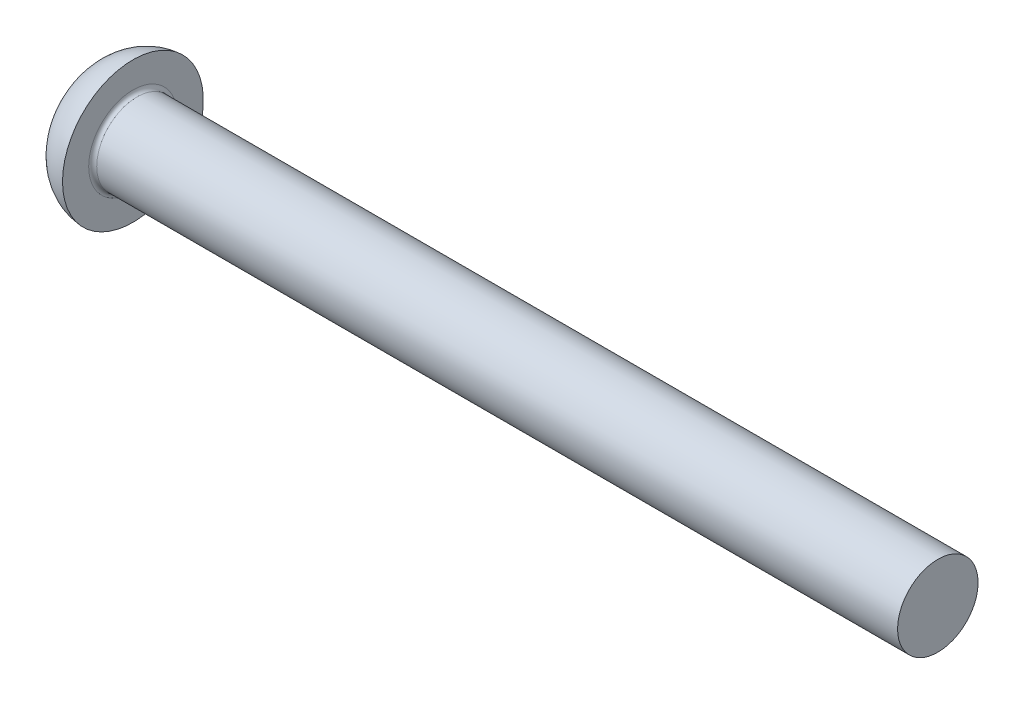
ISO-10303-21;
HEADER;
FILE_DESCRIPTION(('STEP AP214'),'2;1');
FILE_NAME('part.step','',(''),(''),'','','');
FILE_SCHEMA(('AUTOMOTIVE_DESIGN { 1 0 10303 214 1 1 1 1 }'));
ENDSEC;
DATA;
#1=APPLICATION_CONTEXT('core data for automotive mechanical design processes');
#2=APPLICATION_PROTOCOL_DEFINITION('international standard','automotive_design',2000,#1);
#3=PRODUCT_CONTEXT('',#1,'mechanical');
#4=PRODUCT('Part','Part','',(#3));
#5=PRODUCT_RELATED_PRODUCT_CATEGORY('part','',(#4));
#6=PRODUCT_DEFINITION_FORMATION('','',#4);
#7=PRODUCT_DEFINITION_CONTEXT('part definition',#1,'design');
#8=PRODUCT_DEFINITION('design','',#6,#7);
#9=PRODUCT_DEFINITION_SHAPE('','',#8);
#10=(LENGTH_UNIT() NAMED_UNIT(*) SI_UNIT(.MILLI.,.METRE.));
#11=(NAMED_UNIT(*) PLANE_ANGLE_UNIT() SI_UNIT($,.RADIAN.));
#12=(NAMED_UNIT(*) SI_UNIT($,.STERADIAN.) SOLID_ANGLE_UNIT());
#13=UNCERTAINTY_MEASURE_WITH_UNIT(LENGTH_MEASURE(1.E-05),#10,'distance_accuracy_value','');
#14=(GEOMETRIC_REPRESENTATION_CONTEXT(3) GLOBAL_UNCERTAINTY_ASSIGNED_CONTEXT((#13)) GLOBAL_UNIT_ASSIGNED_CONTEXT((#10,
#11,#12)) REPRESENTATION_CONTEXT('',''));
#15=CARTESIAN_POINT('',(0.,0.,0.));
#16=DIRECTION('',(0.,0.,1.));
#17=DIRECTION('',(1.,0.,0.));
#18=AXIS2_PLACEMENT_3D('',#15,#16,#17);
#19=CARTESIAN_POINT('',(0.91,0.596290812545845,0.231));
#20=DIRECTION('',(1.,0.,0.));
#21=DIRECTION('',(0.,0.,-1.));
#22=AXIS2_PLACEMENT_3D('',#19,#20,#21);
#23=PLANE('',#22);
#24=DIRECTION('',(0.,0.,-1.));
#25=VECTOR('',#24,1.);
#26=CARTESIAN_POINT('',(0.91,0.230999999999997,0.596290812545845));
#27=LINE('',#26,#25);
#28=CARTESIAN_POINT('',(0.91,0.231000000000002,-0.596290812545844));
#29=VERTEX_POINT('',#28);
#30=CARTESIAN_POINT('',(0.909999999988159,0.231000000000001,-0.379840049022971));
#31=VERTEX_POINT('',#30);
#32=EDGE_CURVE('E278',#29,#31,#27,.F.);
#33=ORIENTED_EDGE('',*,*,#32,.F.);
#34=DIRECTION('',(0.,1.,0.));
#35=VECTOR('',#34,1.);
#36=CARTESIAN_POINT('',(0.91,0.231000000000004,-0.596290812545844));
#37=LINE('',#36,#35);
#38=CARTESIAN_POINT('',(0.91,-0.230999999999997,-0.596290812545845));
#39=VERTEX_POINT('',#38);
#40=EDGE_CURVE('E284',#39,#29,#37,.T.);
#41=ORIENTED_EDGE('',*,*,#40,.F.);
#42=DIRECTION('',(0.,0.,1.));
#43=VECTOR('',#42,1.);
#44=CARTESIAN_POINT('',(0.91,-0.230999999999998,-0.596290812545845));
#45=LINE('',#44,#43);
#46=CARTESIAN_POINT('',(0.909999999988159,-0.230999999999999,-0.379840049022973));
#47=VERTEX_POINT('',#46);
#48=EDGE_CURVE('E285',#47,#39,#45,.F.);
#49=ORIENTED_EDGE('',*,*,#48,.F.);
#50=CARTESIAN_POINT('',(0.910000000000111,0.,0.));
#51=DIRECTION('',(-1.,0.,0.));
#52=DIRECTION('',(0.,0.,1.));
#53=AXIS2_PLACEMENT_3D('',#50,#51,#52);
#54=CIRCLE('',#53,0.444566601131235);
#55=EDGE_CURVE('E556',#47,#31,#54,.F.);
#56=ORIENTED_EDGE('',*,*,#55,.T.);
#57=EDGE_LOOP('',(#33,#41,#49,#56));
#58=FACE_BOUND('',#57,.T.);
#59=ADVANCED_FACE('F17',(#58),#23,.F.);
#60=CARTESIAN_POINT('',(0.91,0.596290812545845,0.231));
#61=DIRECTION('',(1.,0.,0.));
#62=DIRECTION('',(0.,0.,-1.));
#63=AXIS2_PLACEMENT_3D('',#60,#61,#62);
#64=PLANE('',#63);
#65=DIRECTION('',(0.,1.,0.));
#66=VECTOR('',#65,1.);
#67=CARTESIAN_POINT('',(0.91,-0.596290812545844,0.231));
#68=LINE('',#67,#66);
#69=CARTESIAN_POINT('',(0.91,0.596290812545844,0.231));
#70=VERTEX_POINT('',#69);
#71=CARTESIAN_POINT('',(0.909999999988159,0.379840049022972,0.231));
#72=VERTEX_POINT('',#71);
#73=EDGE_CURVE('E141',#70,#72,#68,.F.);
#74=ORIENTED_EDGE('',*,*,#73,.F.);
#75=DIRECTION('',(0.,0.,1.));
#76=VECTOR('',#75,1.);
#77=CARTESIAN_POINT('',(0.91,0.596290812545845,0.231));
#78=LINE('',#77,#76);
#79=CARTESIAN_POINT('',(0.91,0.596290812545845,-0.231));
#80=VERTEX_POINT('',#79);
#81=EDGE_CURVE('E159',#80,#70,#78,.T.);
#82=ORIENTED_EDGE('',*,*,#81,.F.);
#83=DIRECTION('',(0.,1.,0.));
#84=VECTOR('',#83,1.);
#85=CARTESIAN_POINT('',(0.91,0.596290812545845,-0.231));
#86=LINE('',#85,#84);
#87=CARTESIAN_POINT('',(0.909999999988159,0.379840049022972,-0.231));
#88=VERTEX_POINT('',#87);
#89=EDGE_CURVE('E143',#88,#80,#86,.T.);
#90=ORIENTED_EDGE('',*,*,#89,.F.);
#91=CARTESIAN_POINT('',(0.910000000000111,0.,0.));
#92=DIRECTION('',(-1.,0.,0.));
#93=DIRECTION('',(0.,0.,1.));
#94=AXIS2_PLACEMENT_3D('',#91,#92,#93);
#95=CIRCLE('',#94,0.444566601131235);
#96=EDGE_CURVE('E137',#88,#72,#95,.F.);
#97=ORIENTED_EDGE('',*,*,#96,.T.);
#98=EDGE_LOOP('',(#74,#82,#90,#97));
#99=FACE_BOUND('',#98,.T.);
#100=ADVANCED_FACE('F139',(#99),#64,.F.);
#101=CARTESIAN_POINT('',(0.91,0.596290812545845,0.231));
#102=DIRECTION('',(1.,0.,0.));
#103=DIRECTION('',(0.,0.,-1.));
#104=AXIS2_PLACEMENT_3D('',#101,#102,#103);
#105=PLANE('',#104);
#106=DIRECTION('',(0.,0.,1.));
#107=VECTOR('',#106,1.);
#108=CARTESIAN_POINT('',(0.91,-0.230999999999998,-0.596290812545845));
#109=LINE('',#108,#107);
#110=CARTESIAN_POINT('',(0.91,-0.231000000000002,0.596290812545844));
#111=VERTEX_POINT('',#110);
#112=CARTESIAN_POINT('',(0.909999999988159,-0.231000000000001,0.379840049022971));
#113=VERTEX_POINT('',#112);
#114=EDGE_CURVE('E257',#111,#113,#109,.F.);
#115=ORIENTED_EDGE('',*,*,#114,.F.);
#116=DIRECTION('',(0.,1.,0.));
#117=VECTOR('',#116,1.);
#118=CARTESIAN_POINT('',(0.909999999999999,-0.231000000000002,0.596290812545844));
#119=LINE('',#118,#117);
#120=CARTESIAN_POINT('',(0.91,0.230999999999997,0.596290812545845));
#121=VERTEX_POINT('',#120);
#122=EDGE_CURVE('E263',#121,#111,#119,.F.);
#123=ORIENTED_EDGE('',*,*,#122,.F.);
#124=DIRECTION('',(0.,0.,-1.));
#125=VECTOR('',#124,1.);
#126=CARTESIAN_POINT('',(0.91,0.230999999999997,0.596290812545845));
#127=LINE('',#126,#125);
#128=CARTESIAN_POINT('',(0.909999999988159,0.230999999999998,0.379840049022973));
#129=VERTEX_POINT('',#128);
#130=EDGE_CURVE('E264',#129,#121,#127,.F.);
#131=ORIENTED_EDGE('',*,*,#130,.F.);
#132=CARTESIAN_POINT('',(0.910000000000111,0.,0.));
#133=DIRECTION('',(-1.,0.,0.));
#134=DIRECTION('',(0.,0.,1.));
#135=AXIS2_PLACEMENT_3D('',#132,#133,#134);
#136=CIRCLE('',#135,0.444566601131235);
#137=EDGE_CURVE('E149',#129,#113,#136,.F.);
#138=ORIENTED_EDGE('',*,*,#137,.T.);
#139=EDGE_LOOP('',(#115,#123,#131,#138));
#140=FACE_BOUND('',#139,.T.);
#141=ADVANCED_FACE('F573',(#140),#105,.F.);
#142=CARTESIAN_POINT('',(0.909999999999966,0.,0.));
#143=DIRECTION('',(-1.,0.,0.));
#144=DIRECTION('',(0.,0.,1.));
#145=AXIS2_PLACEMENT_3D('',#142,#143,#144);
#146=CONICAL_SURFACE('',#145,0.44456660113168,1.25663706143602);
#147=CARTESIAN_POINT('',(1.05444844499492,0.,0.));
#148=VERTEX_POINT('',#147);
#149=VERTEX_LOOP('',#148);
#150=FACE_BOUND('',#149,.T.);
#151=CARTESIAN_POINT('',(0.909999999976208,0.,0.));
#152=DIRECTION('',(-1.,0.,0.));
#153=DIRECTION('',(0.,0.,1.));
#154=AXIS2_PLACEMENT_3D('',#151,#152,#153);
#155=CIRCLE('',#154,0.444566601132124);
#156=EDGE_CURVE('E277',#88,#31,#155,.T.);
#157=ORIENTED_EDGE('',*,*,#156,.T.);
#158=ORIENTED_EDGE('',*,*,#55,.F.);
#159=CARTESIAN_POINT('',(0.909999999976208,0.,0.));
#160=DIRECTION('',(-1.,0.,0.));
#161=DIRECTION('',(0.,0.,1.));
#162=AXIS2_PLACEMENT_3D('',#159,#160,#161);
#163=CIRCLE('',#162,0.444566601132124);
#164=CARTESIAN_POINT('',(0.909999999988159,-0.379840049022972,-0.231));
#165=VERTEX_POINT('',#164);
#166=EDGE_CURVE('E338',#47,#165,#163,.T.);
#167=ORIENTED_EDGE('',*,*,#166,.T.);
#168=CARTESIAN_POINT('',(0.910000000000111,0.,0.));
#169=DIRECTION('',(-1.,0.,0.));
#170=DIRECTION('',(0.,0.,1.));
#171=AXIS2_PLACEMENT_3D('',#168,#169,#170);
#172=CIRCLE('',#171,0.444566601131235);
#173=CARTESIAN_POINT('',(0.909999999988159,-0.379840049022972,0.231));
#174=VERTEX_POINT('',#173);
#175=EDGE_CURVE('E292',#165,#174,#172,.T.);
#176=ORIENTED_EDGE('',*,*,#175,.T.);
#177=CARTESIAN_POINT('',(0.909999999976208,0.,0.));
#178=DIRECTION('',(-1.,0.,0.));
#179=DIRECTION('',(0.,0.,1.));
#180=AXIS2_PLACEMENT_3D('',#177,#178,#179);
#181=CIRCLE('',#180,0.444566601132124);
#182=EDGE_CURVE('E256',#174,#113,#181,.T.);
#183=ORIENTED_EDGE('',*,*,#182,.T.);
#184=ORIENTED_EDGE('',*,*,#137,.F.);
#185=CARTESIAN_POINT('',(0.909999999976208,0.,0.));
#186=DIRECTION('',(-1.,0.,0.));
#187=DIRECTION('',(0.,0.,1.));
#188=AXIS2_PLACEMENT_3D('',#185,#186,#187);
#189=CIRCLE('',#188,0.444566601132124);
#190=EDGE_CURVE('E162',#129,#72,#189,.T.);
#191=ORIENTED_EDGE('',*,*,#190,.T.);
#192=ORIENTED_EDGE('',*,*,#96,.F.);
#193=EDGE_LOOP('',(#157,#158,#167,#176,#183,#184,#191,#192));
#194=FACE_BOUND('',#193,.T.);
#195=ADVANCED_FACE('F163',(#150,#194),#146,.F.);
#196=CARTESIAN_POINT('',(0.91,0.596290812545845,0.231));
#197=DIRECTION('',(1.,0.,0.));
#198=DIRECTION('',(0.,0.,-1.));
#199=AXIS2_PLACEMENT_3D('',#196,#197,#198);
#200=PLANE('',#199);
#201=DIRECTION('',(0.,1.,0.));
#202=VECTOR('',#201,1.);
#203=CARTESIAN_POINT('',(0.91,0.596290812545845,-0.231));
#204=LINE('',#203,#202);
#205=CARTESIAN_POINT('',(0.91,-0.596290812545845,-0.231));
#206=VERTEX_POINT('',#205);
#207=EDGE_CURVE('E288',#206,#165,#204,.T.);
#208=ORIENTED_EDGE('',*,*,#207,.F.);
#209=DIRECTION('',(0.,0.,1.));
#210=VECTOR('',#209,1.);
#211=CARTESIAN_POINT('',(0.91,-0.596290812545845,-0.231));
#212=LINE('',#211,#210);
#213=CARTESIAN_POINT('',(0.91,-0.596290812545844,0.231));
#214=VERTEX_POINT('',#213);
#215=EDGE_CURVE('E244',#214,#206,#212,.F.);
#216=ORIENTED_EDGE('',*,*,#215,.F.);
#217=DIRECTION('',(0.,1.,0.));
#218=VECTOR('',#217,1.);
#219=CARTESIAN_POINT('',(0.91,-0.596290812545844,0.231));
#220=LINE('',#219,#218);
#221=EDGE_CURVE('E250',#174,#214,#220,.F.);
#222=ORIENTED_EDGE('',*,*,#221,.F.);
#223=ORIENTED_EDGE('',*,*,#175,.F.);
#224=EDGE_LOOP('',(#208,#216,#222,#223));
#225=FACE_BOUND('',#224,.T.);
#226=ADVANCED_FACE('F566',(#225),#200,.F.);
#227=CARTESIAN_POINT('',(0.91,0.596290812545845,-0.231));
#228=DIRECTION('',(0.,0.,1.));
#229=DIRECTION('',(1.,0.,0.));
#230=AXIS2_PLACEMENT_3D('',#227,#228,#229);
#231=PLANE('',#230);
#232=CARTESIAN_POINT('',(0.233233534269022,-0.933714068878836,-0.231));
#233=CARTESIAN_POINT('',(0.194551246317978,-0.856285880388038,-0.231));
#234=CARTESIAN_POINT('',(0.160886858239377,-0.777082586312081,-0.231));
#235=CARTESIAN_POINT('',(0.103593881827061,-0.61512578698985,-0.231));
#236=CARTESIAN_POINT('',(0.0799652934933455,-0.532372281743577,-0.231));
#237=CARTESIAN_POINT('',(0.0613546050320735,-0.447843670912146,-0.231));
#238=B_SPLINE_CURVE_WITH_KNOTS('',3,(#232,#233,#234,#235,#236,#237),.UNSPECIFIED.,.F.,.F.,(4,2,
4),(0.,0.258182252207045,0.516364504414091),.UNSPECIFIED.);
#239=CARTESIAN_POINT('',(0.233233534269022,-0.933714068878836,-0.231));
#240=VERTEX_POINT('',#239);
#241=CARTESIAN_POINT('',(0.0613546050148994,-0.447843670917676,-0.231));
#242=VERTEX_POINT('',#241);
#243=EDGE_CURVE('E243',#240,#242,#238,.T.);
#244=ORIENTED_EDGE('',*,*,#243,.F.);
#245=DIRECTION('',(-0.894934391398443,-0.446197753347435,0.));
#246=VECTOR('',#245,1.);
#247=CARTESIAN_POINT('',(0.,-1.05,-0.231));
#248=LINE('',#247,#246);
#249=EDGE_CURVE('E240',#206,#240,#248,.T.);
#250=ORIENTED_EDGE('',*,*,#249,.F.);
#251=ORIENTED_EDGE('',*,*,#207,.T.);
#252=CARTESIAN_POINT('',(0.909999999988168,-0.379840049023501,-0.231));
#253=CARTESIAN_POINT('',(0.768576770926191,-0.391394566126337,-0.231));
#254=CARTESIAN_POINT('',(0.627144704122073,-0.402838793380434,-0.231));
#255=CARTESIAN_POINT('',(0.344262905798272,-0.425506667328228,-0.231));
#256=CARTESIAN_POINT('',(0.202813174279935,-0.43673031403872,-0.231));
#257=CARTESIAN_POINT('',(0.0613546050208023,-0.447843670917266,-0.231));
#258=B_SPLINE_CURVE_WITH_KNOTS('',3,(#252,#253,#254,#255,#256,#257),.UNSPECIFIED.,.F.,.F.,(4,2,
4),(0.,0.425682979130421,0.851365925851129),.UNSPECIFIED.);
#259=EDGE_CURVE('E291',#165,#242,#258,.T.);
#260=ORIENTED_EDGE('',*,*,#259,.T.);
#261=EDGE_LOOP('',(#244,#250,#251,#260));
#262=FACE_BOUND('',#261,.T.);
#263=ADVANCED_FACE('F488',(#262),#231,.T.);
#264=CARTESIAN_POINT('',(0.0613546051226876,0.,0.));
#265=DIRECTION('',(-1.,0.,0.));
#266=DIRECTION('',(0.,0.,1.));
#267=AXIS2_PLACEMENT_3D('',#264,#265,#266);
#268=CONICAL_SURFACE('',#267,0.503909668069014,0.069813170083757);
#269=CARTESIAN_POINT('',(0.0613546050286668,-0.230999999999998,-0.447843670916594));
#270=CARTESIAN_POINT('',(0.202813174287804,-0.230999999999998,-0.436730314038055));
#271=CARTESIAN_POINT('',(0.344262905806148,-0.230999999999998,-0.425506667327577));
#272=CARTESIAN_POINT('',(0.627144704129961,-0.230999999999999,-0.402838793379824));
#273=CARTESIAN_POINT('',(0.768576770934086,-0.230999999999999,-0.391394566125755));
#274=CARTESIAN_POINT('',(0.90999999999607,-0.230999999999999,-0.379840049022953));
#275=B_SPLINE_CURVE_WITH_KNOTS('',3,(#269,#270,#271,#272,#273,#274),.UNSPECIFIED.,.F.,.F.,(4,2,
4),(0.,0.425682946720722,0.851365925851157),.UNSPECIFIED.);
#276=CARTESIAN_POINT('',(0.0613546050188338,-0.230999999999998,-0.447843670889612));
#277=VERTEX_POINT('',#276);
#278=EDGE_CURVE('E335',#277,#47,#275,.T.);
#279=ORIENTED_EDGE('',*,*,#278,.F.);
#280=CARTESIAN_POINT('',(0.0613546050090008,0.,0.));
#281=DIRECTION('',(-1.,0.,0.));
#282=DIRECTION('',(0.,0.,1.));
#283=AXIS2_PLACEMENT_3D('',#280,#281,#282);
#284=CIRCLE('',#283,0.503909668076963);
#285=EDGE_CURVE('E480',#242,#277,#284,.F.);
#286=ORIENTED_EDGE('',*,*,#285,.F.);
#287=ORIENTED_EDGE('',*,*,#259,.F.);
#288=ORIENTED_EDGE('',*,*,#166,.F.);
#289=EDGE_LOOP('',(#279,#286,#287,#288));
#290=FACE_BOUND('',#289,.T.);
#291=ADVANCED_FACE('F460',(#290),#268,.F.);
#292=CARTESIAN_POINT('',(0.91,-0.230999999999998,-0.596290812545845));
#293=DIRECTION('',(0.,1.,0.));
#294=DIRECTION('',(0.,0.,1.));
#295=AXIS2_PLACEMENT_3D('',#292,#293,#294);
#296=PLANE('',#295);
#297=ORIENTED_EDGE('',*,*,#48,.T.);
#298=DIRECTION('',(0.894934391398443,0.,0.446197753347435));
#299=VECTOR('',#298,1.);
#300=CARTESIAN_POINT('',(0.,-0.230999999999997,-1.05));
#301=LINE('',#300,#299);
#302=CARTESIAN_POINT('',(0.233233534269021,-0.230999999999997,-0.933714068878837));
#303=VERTEX_POINT('',#302);
#304=EDGE_CURVE('E281',#303,#39,#301,.T.);
#305=ORIENTED_EDGE('',*,*,#304,.F.);
#306=CARTESIAN_POINT('',(2.1,-0.230999999999998,0.));
#307=DIRECTION('',(0.,1.,0.));
#308=DIRECTION('',(0.,0.,1.));
#309=AXIS2_PLACEMENT_3D('',#306,#307,#308);
#310=CIRCLE('',#309,2.08725633308418);
#311=EDGE_CURVE('E478',#277,#303,#310,.F.);
#312=ORIENTED_EDGE('',*,*,#311,.F.);
#313=ORIENTED_EDGE('',*,*,#278,.T.);
#314=EDGE_LOOP('',(#297,#305,#312,#313));
#315=FACE_BOUND('',#314,.T.);
#316=ADVANCED_FACE('F462',(#315),#296,.T.);
#317=CARTESIAN_POINT('',(0.,0.231000000000004,-1.05));
#318=DIRECTION('',(-0.446197753347435,0.,0.894934391398443));
#319=DIRECTION('',(0.894934391398443,0.,0.446197753347435));
#320=AXIS2_PLACEMENT_3D('',#317,#318,#319);
#321=PLANE('',#320);
#322=ORIENTED_EDGE('',*,*,#40,.T.);
#323=DIRECTION('',(0.894934391398443,0.,0.446197753347435));
#324=VECTOR('',#323,1.);
#325=CARTESIAN_POINT('',(0.233233534269022,0.231000000000003,-0.933714068878835));
#326=LINE('',#325,#324);
#327=CARTESIAN_POINT('',(0.233233534269021,0.231000000000005,-0.933714068878836));
#328=VERTEX_POINT('',#327);
#329=EDGE_CURVE('E274',#328,#29,#326,.T.);
#330=ORIENTED_EDGE('',*,*,#329,.F.);
#331=CARTESIAN_POINT('',(0.233233534269022,-0.230999999999998,-0.933714068878837));
#332=CARTESIAN_POINT('',(0.225630364204127,-0.154000000000003,-0.937504869002155));
#333=CARTESIAN_POINT('',(0.221828779171679,-0.0770000000000073,-0.939400269063814));
#334=CARTESIAN_POINT('',(0.221828779171678,0.0769999999999833,-0.939400269063813));
#335=CARTESIAN_POINT('',(0.225630364204124,0.153999999999979,-0.937504869002154));
#336=CARTESIAN_POINT('',(0.233233534269018,0.230999999999974,-0.933714068878836));
#337=B_SPLINE_CURVE_WITH_KNOTS('',3,(#331,#332,#333,#334,#335,#336),.UNSPECIFIED.,.F.,.F.,(4,2,
4),(0.,0.231351250939707,0.462702501879415),.UNSPECIFIED.);
#338=EDGE_CURVE('E471',#303,#328,#337,.T.);
#339=ORIENTED_EDGE('',*,*,#338,.F.);
#340=ORIENTED_EDGE('',*,*,#304,.T.);
#341=EDGE_LOOP('',(#322,#330,#339,#340));
#342=FACE_BOUND('',#341,.T.);
#343=ADVANCED_FACE('F465',(#342),#321,.T.);
#344=CARTESIAN_POINT('',(0.91,0.230999999999997,0.596290812545845));
#345=DIRECTION('',(0.,-1.,0.));
#346=DIRECTION('',(0.,0.,-1.));
#347=AXIS2_PLACEMENT_3D('',#344,#345,#346);
#348=PLANE('',#347);
#349=CARTESIAN_POINT('',(2.1,0.231000000000003,0.));
#350=DIRECTION('',(0.,1.,0.));
#351=DIRECTION('',(0.,0.,1.));
#352=AXIS2_PLACEMENT_3D('',#349,#350,#351);
#353=CIRCLE('',#352,2.08725633308418);
#354=CARTESIAN_POINT('',(0.061354605014925,0.231000000000002,-0.447843670889917));
#355=VERTEX_POINT('',#354);
#356=EDGE_CURVE('E421',#328,#355,#353,.T.);
#357=ORIENTED_EDGE('',*,*,#356,.F.);
#358=ORIENTED_EDGE('',*,*,#329,.T.);
#359=ORIENTED_EDGE('',*,*,#32,.T.);
#360=CARTESIAN_POINT('',(0.909999999988164,0.231000000000001,-0.379840049023501));
#361=CARTESIAN_POINT('',(0.768576770926196,0.231000000000001,-0.391394566126336));
#362=CARTESIAN_POINT('',(0.627144704122088,0.231000000000001,-0.402838793380432));
#363=CARTESIAN_POINT('',(0.344262905798305,0.231000000000001,-0.425506667328224));
#364=CARTESIAN_POINT('',(0.202813174279977,0.231000000000001,-0.436730314038716));
#365=CARTESIAN_POINT('',(0.0613546050208537,0.231000000000002,-0.447843670917261));
#366=B_SPLINE_CURVE_WITH_KNOTS('',3,(#360,#361,#362,#363,#364,#365),.UNSPECIFIED.,.F.,.F.,(4,2,
4),(0.,0.425682979130393,0.851365925851074),.UNSPECIFIED.);
#367=EDGE_CURVE('E325',#31,#355,#366,.T.);
#368=ORIENTED_EDGE('',*,*,#367,.T.);
#369=EDGE_LOOP('',(#357,#358,#359,#368));
#370=FACE_BOUND('',#369,.T.);
#371=ADVANCED_FACE('F437',(#370),#348,.T.);
#372=CARTESIAN_POINT('',(0.0613546051226876,0.,0.));
#373=DIRECTION('',(-1.,0.,0.));
#374=DIRECTION('',(0.,0.,1.));
#375=AXIS2_PLACEMENT_3D('',#372,#373,#374);
#376=CONICAL_SURFACE('',#375,0.503909668069014,0.069813170083757);
#377=ORIENTED_EDGE('',*,*,#367,.F.);
#378=ORIENTED_EDGE('',*,*,#156,.F.);
#379=CARTESIAN_POINT('',(0.0613546050285694,0.447843670916601,-0.231));
#380=CARTESIAN_POINT('',(0.202813174287723,0.43673031403806,-0.231));
#381=CARTESIAN_POINT('',(0.344262905806083,0.425506667327581,-0.231));
#382=CARTESIAN_POINT('',(0.627144704129929,0.402838793379826,-0.231));
#383=CARTESIAN_POINT('',(0.76857677093407,0.391394566125756,-0.231));
#384=CARTESIAN_POINT('',(0.909999999996071,0.379840049022953,-0.231));
#385=B_SPLINE_CURVE_WITH_KNOTS('',3,(#379,#380,#381,#382,#383,#384),.UNSPECIFIED.,.F.,.F.,(4,2,
4),(0.,0.425682946720771,0.851365925851255),.UNSPECIFIED.);
#386=CARTESIAN_POINT('',(0.0613546050304112,0.447843670914783,-0.231));
#387=VERTEX_POINT('',#386);
#388=EDGE_CURVE('E189',#387,#88,#385,.T.);
#389=ORIENTED_EDGE('',*,*,#388,.F.);
#390=CARTESIAN_POINT('',(0.0613546050090008,0.,0.));
#391=DIRECTION('',(-1.,0.,0.));
#392=DIRECTION('',(0.,0.,1.));
#393=AXIS2_PLACEMENT_3D('',#390,#391,#392);
#394=CIRCLE('',#393,0.503909668076963);
#395=EDGE_CURVE('E420',#355,#387,#394,.F.);
#396=ORIENTED_EDGE('',*,*,#395,.F.);
#397=EDGE_LOOP('',(#377,#378,#389,#396));
#398=FACE_BOUND('',#397,.T.);
#399=ADVANCED_FACE('F431',(#398),#376,.F.);
#400=CARTESIAN_POINT('',(0.91,0.596290812545845,-0.231));
#401=DIRECTION('',(0.,0.,1.));
#402=DIRECTION('',(1.,0.,0.));
#403=AXIS2_PLACEMENT_3D('',#400,#401,#402);
#404=PLANE('',#403);
#405=ORIENTED_EDGE('',*,*,#89,.T.);
#406=DIRECTION('',(0.894934391398443,-0.446197753347436,0.));
#407=VECTOR('',#406,1.);
#408=CARTESIAN_POINT('',(0.91,0.596290812545845,-0.231));
#409=LINE('',#408,#407);
#410=CARTESIAN_POINT('',(0.233233534269021,0.933714068878837,-0.231));
#411=VERTEX_POINT('',#410);
#412=EDGE_CURVE('E269',#411,#80,#409,.T.);
#413=ORIENTED_EDGE('',*,*,#412,.F.);
#414=CARTESIAN_POINT('',(0.061354605032253,0.447843670912965,-0.230999999999999));
#415=CARTESIAN_POINT('',(0.0799652934935289,0.53237228174425,-0.231));
#416=CARTESIAN_POINT('',(0.103593881827231,0.615125786990382,-0.231));
#417=CARTESIAN_POINT('',(0.160886858239487,0.77708258631234,-0.231));
#418=CARTESIAN_POINT('',(0.194551246318041,0.856285880388165,-0.231));
#419=CARTESIAN_POINT('',(0.233233534269022,0.933714068878837,-0.231));
#420=B_SPLINE_CURVE_WITH_KNOTS('',3,(#414,#415,#416,#417,#418,#419),.UNSPECIFIED.,.F.,.F.,(4,2,
4),(0.,0.258182252206627,0.516364504413254),.UNSPECIFIED.);
#421=EDGE_CURVE('E417',#387,#411,#420,.T.);
#422=ORIENTED_EDGE('',*,*,#421,.F.);
#423=ORIENTED_EDGE('',*,*,#388,.T.);
#424=EDGE_LOOP('',(#405,#413,#422,#423));
#425=FACE_BOUND('',#424,.T.);
#426=ADVANCED_FACE('F428',(#425),#404,.T.);
#427=CARTESIAN_POINT('',(0.91,0.596290812545845,0.231));
#428=DIRECTION('',(-0.446197753347436,-0.894934391398443,0.));
#429=DIRECTION('',(0.894934391398443,-0.446197753347436,0.));
#430=AXIS2_PLACEMENT_3D('',#427,#428,#429);
#431=PLANE('',#430);
#432=ORIENTED_EDGE('',*,*,#81,.T.);
#433=DIRECTION('',(0.894934391398443,-0.446197753347436,0.));
#434=VECTOR('',#433,1.);
#435=CARTESIAN_POINT('',(0.233233534269022,0.933714068878837,0.231));
#436=LINE('',#435,#434);
#437=CARTESIAN_POINT('',(0.233233534269022,0.933714068878837,0.230999999999999));
#438=VERTEX_POINT('',#437);
#439=EDGE_CURVE('E158',#438,#70,#436,.T.);
#440=ORIENTED_EDGE('',*,*,#439,.F.);
#441=CARTESIAN_POINT('',(0.233233534269022,0.933714068878836,-0.231));
#442=CARTESIAN_POINT('',(0.225630364241753,0.937504868983383,-0.154));
#443=CARTESIAN_POINT('',(0.221828779228121,0.939400269035661,-0.0770000000000001));
#444=CARTESIAN_POINT('',(0.22182877922813,0.939400269035679,0.0769999999999963));
#445=CARTESIAN_POINT('',(0.225630364241771,0.937504868983419,0.153999999999993));
#446=CARTESIAN_POINT('',(0.233233534269047,0.93371406887889,0.230999999999989));
#447=B_SPLINE_CURVE_WITH_KNOTS('',3,(#441,#442,#443,#444,#445,#446),.UNSPECIFIED.,.F.,.F.,(4,2,
4),(0.,0.231351250936247,0.462702501872483),.UNSPECIFIED.);
#448=EDGE_CURVE('E213',#411,#438,#447,.T.);
#449=ORIENTED_EDGE('',*,*,#448,.F.);
#450=ORIENTED_EDGE('',*,*,#412,.T.);
#451=EDGE_LOOP('',(#432,#440,#449,#450));
#452=FACE_BOUND('',#451,.T.);
#453=ADVANCED_FACE('F201',(#452),#431,.T.);
#454=CARTESIAN_POINT('',(0.91,-0.596290812545844,0.231));
#455=DIRECTION('',(0.,0.,-1.));
#456=DIRECTION('',(-1.,0.,0.));
#457=AXIS2_PLACEMENT_3D('',#454,#455,#456);
#458=PLANE('',#457);
#459=CARTESIAN_POINT('',(0.233233534269022,0.933714068878837,0.230999999999999));
#460=CARTESIAN_POINT('',(0.194551246317978,0.856285880388038,0.230999999999999));
#461=CARTESIAN_POINT('',(0.160886858239377,0.777082586312081,0.231));
#462=CARTESIAN_POINT('',(0.103593881827061,0.61512578698985,0.231));
#463=CARTESIAN_POINT('',(0.0799652934933456,0.532372281743577,0.230999999999999));
#464=CARTESIAN_POINT('',(0.0613546050320735,0.447843670912145,0.230999999999999));
#465=B_SPLINE_CURVE_WITH_KNOTS('',3,(#459,#460,#461,#462,#463,#464),.UNSPECIFIED.,.F.,.F.,(4,2,
4),(0.,0.258182252207046,0.516364504414091),.UNSPECIFIED.);
#466=CARTESIAN_POINT('',(0.0613546050148992,0.447843670917676,0.231));
#467=VERTEX_POINT('',#466);
#468=EDGE_CURVE('E205',#438,#467,#465,.T.);
#469=ORIENTED_EDGE('',*,*,#468,.F.);
#470=ORIENTED_EDGE('',*,*,#439,.T.);
#471=ORIENTED_EDGE('',*,*,#73,.T.);
#472=CARTESIAN_POINT('',(0.909999999988168,0.379840049023501,0.231));
#473=CARTESIAN_POINT('',(0.768576770926191,0.391394566126337,0.231));
#474=CARTESIAN_POINT('',(0.627144704122073,0.402838793380433,0.231));
#475=CARTESIAN_POINT('',(0.344262905798272,0.425506667328228,0.231));
#476=CARTESIAN_POINT('',(0.202813174279935,0.43673031403872,0.231));
#477=CARTESIAN_POINT('',(0.0613546050208022,0.447843670917266,0.231));
#478=B_SPLINE_CURVE_WITH_KNOTS('',3,(#472,#473,#474,#475,#476,#477),.UNSPECIFIED.,.F.,.F.,(4,2,
4),(0.,0.425682979130421,0.85136592585113),.UNSPECIFIED.);
#479=EDGE_CURVE('E156',#72,#467,#478,.T.);
#480=ORIENTED_EDGE('',*,*,#479,.T.);
#481=EDGE_LOOP('',(#469,#470,#471,#480));
#482=FACE_BOUND('',#481,.T.);
#483=ADVANCED_FACE('F154',(#482),#458,.T.);
#484=CARTESIAN_POINT('',(0.0613546051226876,0.,0.));
#485=DIRECTION('',(-1.,0.,0.));
#486=DIRECTION('',(0.,0.,1.));
#487=AXIS2_PLACEMENT_3D('',#484,#485,#486);
#488=CONICAL_SURFACE('',#487,0.503909668069014,0.069813170083757);
#489=CARTESIAN_POINT('',(0.0613546050286666,0.230999999999998,0.447843670916594));
#490=CARTESIAN_POINT('',(0.202813174287804,0.230999999999998,0.436730314038055));
#491=CARTESIAN_POINT('',(0.344262905806147,0.230999999999998,0.425506667327577));
#492=CARTESIAN_POINT('',(0.627144704129961,0.230999999999998,0.402838793379824));
#493=CARTESIAN_POINT('',(0.768576770934086,0.230999999999998,0.391394566125756));
#494=CARTESIAN_POINT('',(0.90999999999607,0.230999999999998,0.379840049022954));
#495=B_SPLINE_CURVE_WITH_KNOTS('',3,(#489,#490,#491,#492,#493,#494),.UNSPECIFIED.,.F.,.F.,(4,2,
4),(0.,0.425682946720722,0.851365925851157),.UNSPECIFIED.);
#496=CARTESIAN_POINT('',(0.0613546050188337,0.230999999999998,0.447843670889612));
#497=VERTEX_POINT('',#496);
#498=EDGE_CURVE('E167',#497,#129,#495,.T.);
#499=ORIENTED_EDGE('',*,*,#498,.F.);
#500=CARTESIAN_POINT('',(0.0613546050090008,0.,0.));
#501=DIRECTION('',(-1.,0.,0.));
#502=DIRECTION('',(0.,0.,1.));
#503=AXIS2_PLACEMENT_3D('',#500,#501,#502);
#504=CIRCLE('',#503,0.503909668076963);
#505=EDGE_CURVE('E171',#467,#497,#504,.F.);
#506=ORIENTED_EDGE('',*,*,#505,.F.);
#507=ORIENTED_EDGE('',*,*,#479,.F.);
#508=ORIENTED_EDGE('',*,*,#190,.F.);
#509=EDGE_LOOP('',(#499,#506,#507,#508));
#510=FACE_BOUND('',#509,.T.);
#511=ADVANCED_FACE('F169',(#510),#488,.F.);
#512=CARTESIAN_POINT('',(0.91,0.230999999999997,0.596290812545845));
#513=DIRECTION('',(0.,-1.,0.));
#514=DIRECTION('',(0.,0.,-1.));
#515=AXIS2_PLACEMENT_3D('',#512,#513,#514);
#516=PLANE('',#515);
#517=ORIENTED_EDGE('',*,*,#130,.T.);
#518=DIRECTION('',(-0.894934391398443,0.,0.446197753347436));
#519=VECTOR('',#518,1.);
#520=CARTESIAN_POINT('',(0.910000000000001,0.230999999999997,0.596290812545845));
#521=LINE('',#520,#519);
#522=CARTESIAN_POINT('',(0.233233534269022,0.230999999999997,0.933714068878838));
#523=VERTEX_POINT('',#522);
#524=EDGE_CURVE('E260',#523,#121,#521,.F.);
#525=ORIENTED_EDGE('',*,*,#524,.F.);
#526=CARTESIAN_POINT('',(2.1,0.230999999999998,0.));
#527=DIRECTION('',(0.,1.,0.));
#528=DIRECTION('',(0.,0.,1.));
#529=AXIS2_PLACEMENT_3D('',#526,#527,#528);
#530=CIRCLE('',#529,2.08725633308418);
#531=EDGE_CURVE('E409',#497,#523,#530,.T.);
#532=ORIENTED_EDGE('',*,*,#531,.F.);
#533=ORIENTED_EDGE('',*,*,#498,.T.);
#534=EDGE_LOOP('',(#517,#525,#532,#533));
#535=FACE_BOUND('',#534,.T.);
#536=ADVANCED_FACE('F399',(#535),#516,.T.);
#537=CARTESIAN_POINT('',(0.91,-0.231000000000002,0.596290812545844));
#538=DIRECTION('',(-0.446197753347436,0.,-0.894934391398443));
#539=DIRECTION('',(-0.894934391398443,0.,0.446197753347436));
#540=AXIS2_PLACEMENT_3D('',#537,#538,#539);
#541=PLANE('',#540);
#542=ORIENTED_EDGE('',*,*,#122,.T.);
#543=DIRECTION('',(0.894934391398443,0.,-0.446197753347436));
#544=VECTOR('',#543,1.);
#545=CARTESIAN_POINT('',(0.233233534269022,-0.231000000000003,0.933714068878836));
#546=LINE('',#545,#544);
#547=CARTESIAN_POINT('',(0.233233534269022,-0.231000000000004,0.933714068878836));
#548=VERTEX_POINT('',#547);
#549=EDGE_CURVE('E253',#548,#111,#546,.T.);
#550=ORIENTED_EDGE('',*,*,#549,.F.);
#551=CARTESIAN_POINT('',(0.233233534269023,0.230999999999998,0.933714068878838));
#552=CARTESIAN_POINT('',(0.225630364204127,0.154000000000003,0.937504869002155));
#553=CARTESIAN_POINT('',(0.221828779171679,0.0770000000000076,0.939400269063814));
#554=CARTESIAN_POINT('',(0.221828779171678,-0.076999999999983,0.939400269063813));
#555=CARTESIAN_POINT('',(0.225630364204124,-0.153999999999978,0.937504869002154));
#556=CARTESIAN_POINT('',(0.233233534269018,-0.230999999999974,0.933714068878836));
#557=B_SPLINE_CURVE_WITH_KNOTS('',3,(#551,#552,#553,#554,#555,#556),.UNSPECIFIED.,.F.,.F.,(4,2,
4),(0.,0.231351250939707,0.462702501879415),.UNSPECIFIED.);
#558=EDGE_CURVE('E402',#523,#548,#557,.T.);
#559=ORIENTED_EDGE('',*,*,#558,.F.);
#560=ORIENTED_EDGE('',*,*,#524,.T.);
#561=EDGE_LOOP('',(#542,#550,#559,#560));
#562=FACE_BOUND('',#561,.T.);
#563=ADVANCED_FACE('F395',(#562),#541,.T.);
#564=CARTESIAN_POINT('',(0.91,-0.230999999999998,-0.596290812545845));
#565=DIRECTION('',(0.,1.,0.));
#566=DIRECTION('',(0.,0.,1.));
#567=AXIS2_PLACEMENT_3D('',#564,#565,#566);
#568=PLANE('',#567);
#569=CARTESIAN_POINT('',(2.1,-0.231000000000003,0.));
#570=DIRECTION('',(0.,1.,0.));
#571=DIRECTION('',(0.,0.,1.));
#572=AXIS2_PLACEMENT_3D('',#569,#570,#571);
#573=CIRCLE('',#572,2.08725633308418);
#574=CARTESIAN_POINT('',(0.061354605014925,-0.231000000000002,0.447843670889917));
#575=VERTEX_POINT('',#574);
#576=EDGE_CURVE('E408',#548,#575,#573,.F.);
#577=ORIENTED_EDGE('',*,*,#576,.F.);
#578=ORIENTED_EDGE('',*,*,#549,.T.);
#579=ORIENTED_EDGE('',*,*,#114,.T.);
#580=CARTESIAN_POINT('',(0.909999999988164,-0.231000000000001,0.379840049023501));
#581=CARTESIAN_POINT('',(0.768576770926196,-0.231000000000001,0.391394566126336));
#582=CARTESIAN_POINT('',(0.627144704122088,-0.231000000000001,0.402838793380432));
#583=CARTESIAN_POINT('',(0.344262905798305,-0.231000000000001,0.425506667328225));
#584=CARTESIAN_POINT('',(0.202813174279977,-0.231000000000001,0.436730314038716));
#585=CARTESIAN_POINT('',(0.0613546050208538,-0.231000000000001,0.447843670917261));
#586=B_SPLINE_CURVE_WITH_KNOTS('',3,(#580,#581,#582,#583,#584,#585),.UNSPECIFIED.,.F.,.F.,(4,2,
4),(0.,0.425682979130393,0.851365925851074),.UNSPECIFIED.);
#587=EDGE_CURVE('E304',#113,#575,#586,.T.);
#588=ORIENTED_EDGE('',*,*,#587,.T.);
#589=EDGE_LOOP('',(#577,#578,#579,#588));
#590=FACE_BOUND('',#589,.T.);
#591=ADVANCED_FACE('F391',(#590),#568,.T.);
#592=CARTESIAN_POINT('',(0.0613546051226876,0.,0.));
#593=DIRECTION('',(-1.,0.,0.));
#594=DIRECTION('',(0.,0.,1.));
#595=AXIS2_PLACEMENT_3D('',#592,#593,#594);
#596=CONICAL_SURFACE('',#595,0.503909668069014,0.069813170083757);
#597=ORIENTED_EDGE('',*,*,#587,.F.);
#598=ORIENTED_EDGE('',*,*,#182,.F.);
#599=CARTESIAN_POINT('',(0.0613546050285691,-0.447843670916601,0.231));
#600=CARTESIAN_POINT('',(0.202813174287723,-0.436730314038061,0.231));
#601=CARTESIAN_POINT('',(0.344262905806083,-0.425506667327581,0.231));
#602=CARTESIAN_POINT('',(0.627144704129929,-0.402838793379826,0.231));
#603=CARTESIAN_POINT('',(0.76857677093407,-0.391394566125756,0.231));
#604=CARTESIAN_POINT('',(0.909999999996071,-0.379840049022953,0.231));
#605=B_SPLINE_CURVE_WITH_KNOTS('',3,(#599,#600,#601,#602,#603,#604),.UNSPECIFIED.,.F.,.F.,(4,2,
4),(0.,0.425682946720771,0.851365925851255),.UNSPECIFIED.);
#606=CARTESIAN_POINT('',(0.0613546050304111,-0.447843670914783,0.231));
#607=VERTEX_POINT('',#606);
#608=EDGE_CURVE('E300',#607,#174,#605,.T.);
#609=ORIENTED_EDGE('',*,*,#608,.F.);
#610=CARTESIAN_POINT('',(0.0613546050090008,0.,0.));
#611=DIRECTION('',(-1.,0.,0.));
#612=DIRECTION('',(0.,0.,1.));
#613=AXIS2_PLACEMENT_3D('',#610,#611,#612);
#614=CIRCLE('',#613,0.503909668076963);
#615=EDGE_CURVE('E363',#575,#607,#614,.F.);
#616=ORIENTED_EDGE('',*,*,#615,.F.);
#617=EDGE_LOOP('',(#597,#598,#609,#616));
#618=FACE_BOUND('',#617,.T.);
#619=ADVANCED_FACE('F369',(#618),#596,.F.);
#620=CARTESIAN_POINT('',(0.91,-0.596290812545844,0.231));
#621=DIRECTION('',(0.,0.,-1.));
#622=DIRECTION('',(-1.,0.,0.));
#623=AXIS2_PLACEMENT_3D('',#620,#621,#622);
#624=PLANE('',#623);
#625=ORIENTED_EDGE('',*,*,#221,.T.);
#626=DIRECTION('',(-0.894934391398443,-0.446197753347435,0.));
#627=VECTOR('',#626,1.);
#628=CARTESIAN_POINT('',(0.,-1.05,0.231));
#629=LINE('',#628,#627);
#630=CARTESIAN_POINT('',(0.233233534269022,-0.933714068878836,0.231));
#631=VERTEX_POINT('',#630);
#632=EDGE_CURVE('E247',#631,#214,#629,.F.);
#633=ORIENTED_EDGE('',*,*,#632,.F.);
#634=CARTESIAN_POINT('',(0.061354605032253,-0.447843670912965,0.231));
#635=CARTESIAN_POINT('',(0.0799652934935289,-0.53237228174425,0.231));
#636=CARTESIAN_POINT('',(0.103593881827231,-0.615125786990382,0.231));
#637=CARTESIAN_POINT('',(0.160886858239487,-0.777082586312339,0.231));
#638=CARTESIAN_POINT('',(0.194551246318041,-0.856285880388164,0.231));
#639=CARTESIAN_POINT('',(0.233233534269022,-0.933714068878836,0.231));
#640=B_SPLINE_CURVE_WITH_KNOTS('',3,(#634,#635,#636,#637,#638,#639),.UNSPECIFIED.,.F.,.F.,(4,2,
4),(0.,0.258182252206627,0.516364504413254),.UNSPECIFIED.);
#641=EDGE_CURVE('E356',#607,#631,#640,.T.);
#642=ORIENTED_EDGE('',*,*,#641,.F.);
#643=ORIENTED_EDGE('',*,*,#608,.T.);
#644=EDGE_LOOP('',(#625,#633,#642,#643));
#645=FACE_BOUND('',#644,.T.);
#646=ADVANCED_FACE('F365',(#645),#624,.T.);
#647=CARTESIAN_POINT('',(0.,-1.05,-0.231));
#648=DIRECTION('',(-0.446197753347435,0.894934391398443,0.));
#649=DIRECTION('',(-0.894934391398443,-0.446197753347435,0.));
#650=AXIS2_PLACEMENT_3D('',#647,#648,#649);
#651=PLANE('',#650);
#652=ORIENTED_EDGE('',*,*,#215,.T.);
#653=ORIENTED_EDGE('',*,*,#249,.T.);
#654=CARTESIAN_POINT('',(0.233233534269022,-0.933714068878836,0.230999999999999));
#655=CARTESIAN_POINT('',(0.225630364241758,-0.937504868983391,0.154000000000003));
#656=CARTESIAN_POINT('',(0.221828779228128,-0.939400269035673,0.0770000000000058));
#657=CARTESIAN_POINT('',(0.221828779228136,-0.939400269035691,-0.0769999999999904));
#658=CARTESIAN_POINT('',(0.225630364241774,-0.937504868983427,-0.15399999999999));
#659=CARTESIAN_POINT('',(0.233233534269046,-0.93371406887889,-0.230999999999989));
#660=B_SPLINE_CURVE_WITH_KNOTS('',3,(#654,#655,#656,#657,#658,#659),.UNSPECIFIED.,.F.,.F.,(4,2,
4),(0.,0.231351250936238,0.462702501872483),.UNSPECIFIED.);
#661=EDGE_CURVE('E350',#631,#240,#660,.T.);
#662=ORIENTED_EDGE('',*,*,#661,.F.);
#663=ORIENTED_EDGE('',*,*,#632,.T.);
#664=EDGE_LOOP('',(#652,#653,#662,#663));
#665=FACE_BOUND('',#664,.T.);
#666=ADVANCED_FACE('F227',(#665),#651,.T.);
#667=CARTESIAN_POINT('',(2.1,0.,0.));
#668=DIRECTION('',(0.,1.,0.));
#669=DIRECTION('',(1.,0.,0.));
#670=AXIS2_PLACEMENT_3D('',#667,#668,#669);
#671=SPHERICAL_SURFACE('',#670,2.1);
#672=CARTESIAN_POINT('',(0.443908039957306,0.,0.));
#673=DIRECTION('',(-1.,0.,0.));
#674=DIRECTION('',(0.,0.,1.));
#675=AXIS2_PLACEMENT_3D('',#672,#673,#674);
#676=CIRCLE('',#675,1.2912627230281);
#677=CARTESIAN_POINT('',(0.443908039957306,0.,1.2912627230281));
#678=VERTEX_POINT('',#677);
#679=EDGE_CURVE('E347',#678,#678,#676,.F.);
#680=ORIENTED_EDGE('',*,*,#679,.F.);
#681=EDGE_LOOP('',(#680));
#682=FACE_BOUND('',#681,.T.);
#683=ORIENTED_EDGE('',*,*,#641,.T.);
#684=ORIENTED_EDGE('',*,*,#661,.T.);
#685=ORIENTED_EDGE('',*,*,#243,.T.);
#686=ORIENTED_EDGE('',*,*,#285,.T.);
#687=ORIENTED_EDGE('',*,*,#311,.T.);
#688=ORIENTED_EDGE('',*,*,#338,.T.);
#689=ORIENTED_EDGE('',*,*,#356,.T.);
#690=ORIENTED_EDGE('',*,*,#395,.T.);
#691=ORIENTED_EDGE('',*,*,#421,.T.);
#692=ORIENTED_EDGE('',*,*,#448,.T.);
#693=ORIENTED_EDGE('',*,*,#468,.T.);
#694=ORIENTED_EDGE('',*,*,#505,.T.);
#695=ORIENTED_EDGE('',*,*,#531,.T.);
#696=ORIENTED_EDGE('',*,*,#558,.T.);
#697=ORIENTED_EDGE('',*,*,#576,.T.);
#698=ORIENTED_EDGE('',*,*,#615,.T.);
#699=EDGE_LOOP('',(#683,#684,#685,#686,#687,#688,#689,#690,#691,#692,#693,#694,#695,#696,#697,#698));
#700=FACE_BOUND('',#699,.T.);
#701=ADVANCED_FACE('F220',(#682,#700),#671,.T.);
#702=CARTESIAN_POINT('',(1.39024630283885,0.,0.553398309869187));
#703=DIRECTION('',(0.,1.,0.));
#704=DIRECTION('',(0.,0.,1.));
#705=AXIS2_PLACEMENT_3D('',#702,#703,#704);
#706=CIRCLE('',#705,1.2);
#707=TRIMMED_CURVE('',#706,(PARAMETER_VALUE(-2.05010431967805)),
(PARAMETER_VALUE(2.05010431967805)),.T.,.PARAMETER.);
#708=CARTESIAN_POINT('',(1.39024630283885,0.,0.));
#709=DIRECTION('',(-1.,0.,0.));
#710=AXIS1_PLACEMENT('',#708,#709);
#711=SURFACE_OF_REVOLUTION('',#707,#710);
#712=ORIENTED_EDGE('',*,*,#679,.T.);
#713=EDGE_LOOP('',(#712));
#714=FACE_BOUND('',#713,.T.);
#715=CARTESIAN_POINT('',(1.3,0.,0.));
#716=DIRECTION('',(-1.,0.,0.));
#717=DIRECTION('',(0.,0.,1.));
#718=AXIS2_PLACEMENT_3D('',#715,#716,#717);
#719=CIRCLE('',#718,1.75);
#720=CARTESIAN_POINT('',(1.3,0.,1.75));
#721=VERTEX_POINT('',#720);
#722=EDGE_CURVE('E343',#721,#721,#719,.T.);
#723=ORIENTED_EDGE('',*,*,#722,.T.);
#724=EDGE_LOOP('',(#723));
#725=FACE_BOUND('',#724,.T.);
#726=ADVANCED_FACE('F226',(#714,#725),#711,.F.);
#727=CARTESIAN_POINT('',(1.3,1.,0.));
#728=DIRECTION('',(-1.,0.,0.));
#729=DIRECTION('',(0.,0.,1.));
#730=AXIS2_PLACEMENT_3D('',#727,#728,#729);
#731=PLANE('',#730);
#732=ORIENTED_EDGE('',*,*,#722,.F.);
#733=EDGE_LOOP('',(#732));
#734=FACE_BOUND('',#733,.T.);
#735=CARTESIAN_POINT('',(1.3,0.,0.));
#736=DIRECTION('',(1.,0.,0.));
#737=DIRECTION('',(0.,0.,1.));
#738=AXIS2_PLACEMENT_3D('',#735,#736,#737);
#739=CIRCLE('',#738,1.1);
#740=CARTESIAN_POINT('',(1.3,0.,-1.1));
#741=VERTEX_POINT('',#740);
#742=CARTESIAN_POINT('',(1.3,0.,1.1));
#743=VERTEX_POINT('',#742);
#744=EDGE_CURVE('E346',#741,#743,#739,.F.);
#745=ORIENTED_EDGE('',*,*,#744,.T.);
#746=CARTESIAN_POINT('',(1.3,0.,0.));
#747=DIRECTION('',(1.,0.,0.));
#748=DIRECTION('',(0.,0.,-1.));
#749=AXIS2_PLACEMENT_3D('',#746,#747,#748);
#750=CIRCLE('',#749,1.1);
#751=EDGE_CURVE('E36',#743,#741,#750,.F.);
#752=ORIENTED_EDGE('',*,*,#751,.T.);
#753=EDGE_LOOP('',(#745,#752));
#754=FACE_BOUND('',#753,.T.);
#755=ADVANCED_FACE('F527',(#734,#754),#731,.F.);
#756=CARTESIAN_POINT('',(21.3,1.,0.));
#757=DIRECTION('',(-1.,0.,0.));
#758=DIRECTION('',(0.,0.,1.));
#759=AXIS2_PLACEMENT_3D('',#756,#757,#758);
#760=PLANE('',#759);
#761=CARTESIAN_POINT('',(21.3,0.,0.));
#762=DIRECTION('',(-1.,0.,0.));
#763=DIRECTION('',(0.,0.,1.));
#764=AXIS2_PLACEMENT_3D('',#761,#762,#763);
#765=CIRCLE('',#764,1.);
#766=CARTESIAN_POINT('',(21.3,0.,1.));
#767=VERTEX_POINT('',#766);
#768=EDGE_CURVE('E28',#767,#767,#765,.T.);
#769=ORIENTED_EDGE('',*,*,#768,.F.);
#770=EDGE_LOOP('',(#769));
#771=FACE_BOUND('',#770,.T.);
#772=ADVANCED_FACE('F513',(#771),#760,.F.);
#773=CARTESIAN_POINT('',(1.4,0.,0.));
#774=DIRECTION('',(-1.,0.,0.));
#775=DIRECTION('',(0.,0.,1.));
#776=AXIS2_PLACEMENT_3D('',#773,#774,#775);
#777=TOROIDAL_SURFACE('',#776,1.1,0.1);
#778=ORIENTED_EDGE('',*,*,#751,.F.);
#779=ORIENTED_EDGE('',*,*,#744,.F.);
#780=EDGE_LOOP('',(#778,#779));
#781=FACE_BOUND('',#780,.T.);
#782=CARTESIAN_POINT('',(1.4,0.,0.));
#783=DIRECTION('',(-1.,0.,0.));
#784=DIRECTION('',(0.,0.,1.));
#785=AXIS2_PLACEMENT_3D('',#782,#783,#784);
#786=CIRCLE('',#785,1.);
#787=CARTESIAN_POINT('',(1.4,0.,1.));
#788=VERTEX_POINT('',#787);
#789=EDGE_CURVE('E11',#788,#788,#786,.F.);
#790=ORIENTED_EDGE('',*,*,#789,.F.);
#791=EDGE_LOOP('',(#790));
#792=FACE_BOUND('',#791,.T.);
#793=ADVANCED_FACE('F507',(#781,#792),#777,.F.);
#794=CARTESIAN_POINT('',(0.,0.,0.));
#795=DIRECTION('',(-1.,0.,0.));
#796=DIRECTION('',(0.,0.,1.));
#797=AXIS2_PLACEMENT_3D('',#794,#795,#796);
#798=CYLINDRICAL_SURFACE('',#797,1.);
#799=ORIENTED_EDGE('',*,*,#789,.T.);
#800=EDGE_LOOP('',(#799));
#801=FACE_BOUND('',#800,.T.);
#802=ORIENTED_EDGE('',*,*,#768,.T.);
#803=EDGE_LOOP('',(#802));
#804=FACE_BOUND('',#803,.T.);
#805=ADVANCED_FACE('F505',(#801,#804),#798,.T.);
#806=CLOSED_SHELL('',(#59,#100,#141,#195,#226,#263,#291,#316,#343,#371,#399,#426,#453,#483,#511,
#536,#563,#591,#619,#646,#666,#701,#726,#755,#772,#793,#805));
#807=MANIFOLD_SOLID_BREP('B1',#806);
#808=ADVANCED_BREP_SHAPE_REPRESENTATION('',(#18,#807),#14);
#809=SHAPE_DEFINITION_REPRESENTATION(#9,#808);
ENDSEC;
END-ISO-10303-21;
